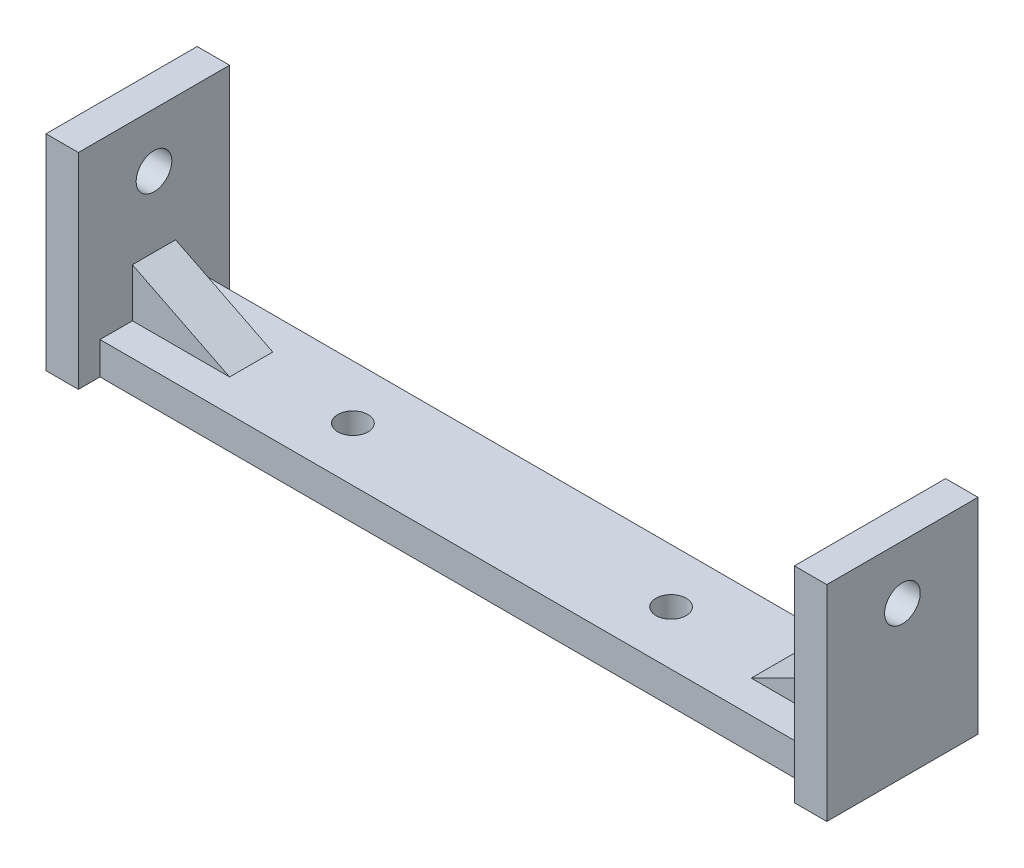
ISO-10303-21;
HEADER;
FILE_DESCRIPTION(('STEP AP214'),'2;1');
FILE_NAME('part.step','',(''),(''),'','','');
FILE_SCHEMA(('AUTOMOTIVE_DESIGN { 1 0 10303 214 1 1 1 1 }'));
ENDSEC;
DATA;
#1=APPLICATION_CONTEXT('core data for automotive mechanical design processes');
#2=APPLICATION_PROTOCOL_DEFINITION('international standard','automotive_design',2000,#1);
#3=PRODUCT_CONTEXT('',#1,'mechanical');
#4=PRODUCT('Part','Part','',(#3));
#5=PRODUCT_RELATED_PRODUCT_CATEGORY('part','',(#4));
#6=PRODUCT_DEFINITION_FORMATION('','',#4);
#7=PRODUCT_DEFINITION_CONTEXT('part definition',#1,'design');
#8=PRODUCT_DEFINITION('design','',#6,#7);
#9=PRODUCT_DEFINITION_SHAPE('','',#8);
#10=(LENGTH_UNIT() NAMED_UNIT(*) SI_UNIT(.MILLI.,.METRE.));
#11=(NAMED_UNIT(*) PLANE_ANGLE_UNIT() SI_UNIT($,.RADIAN.));
#12=(NAMED_UNIT(*) SI_UNIT($,.STERADIAN.) SOLID_ANGLE_UNIT());
#13=UNCERTAINTY_MEASURE_WITH_UNIT(LENGTH_MEASURE(1.E-05),#10,'distance_accuracy_value','');
#14=(GEOMETRIC_REPRESENTATION_CONTEXT(3) GLOBAL_UNCERTAINTY_ASSIGNED_CONTEXT((#13)) GLOBAL_UNIT_ASSIGNED_CONTEXT((#10,
#11,#12)) REPRESENTATION_CONTEXT('',''));
#15=CARTESIAN_POINT('',(0.,0.,0.));
#16=DIRECTION('',(0.,0.,1.));
#17=DIRECTION('',(1.,0.,0.));
#18=AXIS2_PLACEMENT_3D('',#15,#16,#17);
#19=CARTESIAN_POINT('',(0.,3.,0.));
#20=DIRECTION('',(0.,1.,0.));
#21=DIRECTION('',(0.,0.,1.));
#22=AXIS2_PLACEMENT_3D('',#19,#20,#21);
#23=PLANE('',#22);
#24=DIRECTION('',(1.,0.,0.));
#25=VECTOR('',#24,1.);
#26=CARTESIAN_POINT('',(24.15,3.,-2.));
#27=LINE('',#26,#25);
#28=CARTESIAN_POINT('',(24.15,3.,-2.));
#29=VERTEX_POINT('',#28);
#30=CARTESIAN_POINT('',(33.15,3.,-2.));
#31=VERTEX_POINT('',#30);
#32=EDGE_CURVE('E188',#29,#31,#27,.T.);
#33=ORIENTED_EDGE('',*,*,#32,.T.);
#34=DIRECTION('',(0.,0.,-1.));
#35=VECTOR('',#34,1.);
#36=CARTESIAN_POINT('',(33.15,3.,0.));
#37=LINE('',#36,#35);
#38=CARTESIAN_POINT('',(33.15,3.,-5.));
#39=VERTEX_POINT('',#38);
#40=EDGE_CURVE('E269',#31,#39,#37,.T.);
#41=ORIENTED_EDGE('',*,*,#40,.T.);
#42=DIRECTION('',(-1.,0.,0.));
#43=VECTOR('',#42,1.);
#44=CARTESIAN_POINT('',(36.15,3.,-5.));
#45=LINE('',#44,#43);
#46=CARTESIAN_POINT('',(-33.15,3.,-5.));
#47=VERTEX_POINT('',#46);
#48=EDGE_CURVE('E348',#39,#47,#45,.T.);
#49=ORIENTED_EDGE('',*,*,#48,.T.);
#50=DIRECTION('',(0.,0.,1.));
#51=VECTOR('',#50,1.);
#52=CARTESIAN_POINT('',(-33.15,3.,0.));
#53=LINE('',#52,#51);
#54=CARTESIAN_POINT('',(-33.15,3.,-2.));
#55=VERTEX_POINT('',#54);
#56=EDGE_CURVE('E319',#47,#55,#53,.T.);
#57=ORIENTED_EDGE('',*,*,#56,.T.);
#58=DIRECTION('',(1.,0.,0.));
#59=VECTOR('',#58,1.);
#60=CARTESIAN_POINT('',(-24.15,3.,-2.));
#61=LINE('',#60,#59);
#62=CARTESIAN_POINT('',(-24.15,3.,-2.));
#63=VERTEX_POINT('',#62);
#64=EDGE_CURVE('E199',#55,#63,#61,.T.);
#65=ORIENTED_EDGE('',*,*,#64,.T.);
#66=DIRECTION('',(0.,0.,1.));
#67=VECTOR('',#66,1.);
#68=CARTESIAN_POINT('',(-24.15,3.,-2.));
#69=LINE('',#68,#67);
#70=CARTESIAN_POINT('',(-24.15,3.,2.));
#71=VERTEX_POINT('',#70);
#72=EDGE_CURVE('E207',#63,#71,#69,.T.);
#73=ORIENTED_EDGE('',*,*,#72,.T.);
#74=DIRECTION('',(1.,0.,0.));
#75=VECTOR('',#74,1.);
#76=CARTESIAN_POINT('',(-24.15,3.,2.));
#77=LINE('',#76,#75);
#78=CARTESIAN_POINT('',(-33.15,3.,2.));
#79=VERTEX_POINT('',#78);
#80=EDGE_CURVE('E193',#79,#71,#77,.T.);
#81=ORIENTED_EDGE('',*,*,#80,.F.);
#82=CARTESIAN_POINT('',(-33.15,3.,5.));
#83=VERTEX_POINT('',#82);
#84=EDGE_CURVE('E318',#79,#83,#53,.T.);
#85=ORIENTED_EDGE('',*,*,#84,.T.);
#86=DIRECTION('',(1.,0.,0.));
#87=VECTOR('',#86,1.);
#88=CARTESIAN_POINT('',(36.15,3.,4.99999999999999));
#89=LINE('',#88,#87);
#90=CARTESIAN_POINT('',(33.15,3.,4.99999999999999));
#91=VERTEX_POINT('',#90);
#92=EDGE_CURVE('E344',#83,#91,#89,.T.);
#93=ORIENTED_EDGE('',*,*,#92,.T.);
#94=CARTESIAN_POINT('',(33.15,3.,2.));
#95=VERTEX_POINT('',#94);
#96=EDGE_CURVE('E270',#91,#95,#37,.T.);
#97=ORIENTED_EDGE('',*,*,#96,.T.);
#98=DIRECTION('',(1.,0.,0.));
#99=VECTOR('',#98,1.);
#100=CARTESIAN_POINT('',(24.15,3.,2.));
#101=LINE('',#100,#99);
#102=CARTESIAN_POINT('',(24.15,3.,2.));
#103=VERTEX_POINT('',#102);
#104=EDGE_CURVE('E60',#103,#95,#101,.T.);
#105=ORIENTED_EDGE('',*,*,#104,.F.);
#106=DIRECTION('',(0.,0.,1.));
#107=VECTOR('',#106,1.);
#108=CARTESIAN_POINT('',(24.15,3.,-2.));
#109=LINE('',#108,#107);
#110=EDGE_CURVE('E55',#29,#103,#109,.T.);
#111=ORIENTED_EDGE('',*,*,#110,.F.);
#112=EDGE_LOOP('',(#33,#41,#49,#57,#65,#73,#81,#85,#93,#97,#105,#111));
#113=FACE_BOUND('',#112,.T.);
#114=CARTESIAN_POINT('',(-14.73,3.,0.));
#115=DIRECTION('',(0.,1.,0.));
#116=DIRECTION('',(0.,0.,1.));
#117=AXIS2_PLACEMENT_3D('',#114,#115,#116);
#118=CIRCLE('',#117,1.4);
#119=CARTESIAN_POINT('',(-14.73,3.,1.4));
#120=VERTEX_POINT('',#119);
#121=EDGE_CURVE('E336',#120,#120,#118,.T.);
#122=ORIENTED_EDGE('',*,*,#121,.F.);
#123=EDGE_LOOP('',(#122));
#124=FACE_BOUND('',#123,.T.);
#125=CARTESIAN_POINT('',(14.73,3.,0.));
#126=DIRECTION('',(0.,1.,0.));
#127=DIRECTION('',(0.,0.,1.));
#128=AXIS2_PLACEMENT_3D('',#125,#126,#127);
#129=CIRCLE('',#128,1.4);
#130=CARTESIAN_POINT('',(14.73,3.,1.4));
#131=VERTEX_POINT('',#130);
#132=EDGE_CURVE('E328',#131,#131,#129,.T.);
#133=ORIENTED_EDGE('',*,*,#132,.F.);
#134=EDGE_LOOP('',(#133));
#135=FACE_BOUND('',#134,.T.);
#136=ADVANCED_FACE('F39',(#113,#124,#135),#23,.T.);
#137=CARTESIAN_POINT('',(-33.15,19.,7.));
#138=DIRECTION('',(-1.,0.,0.));
#139=DIRECTION('',(0.,0.,1.));
#140=AXIS2_PLACEMENT_3D('',#137,#138,#139);
#141=PLANE('',#140);
#142=CARTESIAN_POINT('',(-33.15,14.,0.));
#143=DIRECTION('',(-1.,0.,0.));
#144=DIRECTION('',(0.,0.,1.));
#145=AXIS2_PLACEMENT_3D('',#142,#143,#144);
#146=CIRCLE('',#145,1.65);
#147=CARTESIAN_POINT('',(-33.15,14.,1.65));
#148=VERTEX_POINT('',#147);
#149=EDGE_CURVE('E220',#148,#148,#146,.T.);
#150=ORIENTED_EDGE('',*,*,#149,.T.);
#151=EDGE_LOOP('',(#150));
#152=FACE_BOUND('',#151,.T.);
#153=DIRECTION('',(0.,1.,0.));
#154=VECTOR('',#153,1.);
#155=CARTESIAN_POINT('',(-33.15,19.,-2.));
#156=LINE('',#155,#154);
#157=CARTESIAN_POINT('',(-33.15,7.5,-2.));
#158=VERTEX_POINT('',#157);
#159=EDGE_CURVE('E177',#55,#158,#156,.T.);
#160=ORIENTED_EDGE('',*,*,#159,.F.);
#161=ORIENTED_EDGE('',*,*,#56,.F.);
#162=DIRECTION('',(0.,-1.,0.));
#163=VECTOR('',#162,1.);
#164=CARTESIAN_POINT('',(-33.15,3.,-5.));
#165=LINE('',#164,#163);
#166=CARTESIAN_POINT('',(-33.15,0.,-5.));
#167=VERTEX_POINT('',#166);
#168=EDGE_CURVE('E352',#47,#167,#165,.T.);
#169=ORIENTED_EDGE('',*,*,#168,.T.);
#170=DIRECTION('',(0.,0.,-1.));
#171=VECTOR('',#170,1.);
#172=CARTESIAN_POINT('',(-33.15,0.,7.));
#173=LINE('',#172,#171);
#174=CARTESIAN_POINT('',(-33.15,0.,-7.00000000000001));
#175=VERTEX_POINT('',#174);
#176=EDGE_CURVE('E295',#167,#175,#173,.T.);
#177=ORIENTED_EDGE('',*,*,#176,.T.);
#178=DIRECTION('',(0.,-1.,0.));
#179=VECTOR('',#178,1.);
#180=CARTESIAN_POINT('',(-33.15,19.,-7.00000000000001));
#181=LINE('',#180,#179);
#182=CARTESIAN_POINT('',(-33.15,19.,-7.00000000000001));
#183=VERTEX_POINT('',#182);
#184=EDGE_CURVE('E306',#183,#175,#181,.T.);
#185=ORIENTED_EDGE('',*,*,#184,.F.);
#186=DIRECTION('',(0.,0.,-1.));
#187=VECTOR('',#186,1.);
#188=CARTESIAN_POINT('',(-33.15,19.,7.));
#189=LINE('',#188,#187);
#190=CARTESIAN_POINT('',(-33.15,19.,7.));
#191=VERTEX_POINT('',#190);
#192=EDGE_CURVE('E286',#191,#183,#189,.T.);
#193=ORIENTED_EDGE('',*,*,#192,.F.);
#194=DIRECTION('',(0.,-1.,0.));
#195=VECTOR('',#194,1.);
#196=CARTESIAN_POINT('',(-33.15,19.,7.));
#197=LINE('',#196,#195);
#198=CARTESIAN_POINT('',(-33.15,0.,7.));
#199=VERTEX_POINT('',#198);
#200=EDGE_CURVE('E310',#191,#199,#197,.T.);
#201=ORIENTED_EDGE('',*,*,#200,.T.);
#202=CARTESIAN_POINT('',(-33.15,0.,5.));
#203=VERTEX_POINT('',#202);
#204=EDGE_CURVE('E296',#199,#203,#173,.T.);
#205=ORIENTED_EDGE('',*,*,#204,.T.);
#206=DIRECTION('',(0.,1.,0.));
#207=VECTOR('',#206,1.);
#208=CARTESIAN_POINT('',(-33.15,3.,5.));
#209=LINE('',#208,#207);
#210=EDGE_CURVE('E323',#203,#83,#209,.T.);
#211=ORIENTED_EDGE('',*,*,#210,.T.);
#212=ORIENTED_EDGE('',*,*,#84,.F.);
#213=DIRECTION('',(0.,1.,0.));
#214=VECTOR('',#213,1.);
#215=CARTESIAN_POINT('',(-33.15,19.,2.));
#216=LINE('',#215,#214);
#217=CARTESIAN_POINT('',(-33.15,7.5,2.));
#218=VERTEX_POINT('',#217);
#219=EDGE_CURVE('E366',#79,#218,#216,.T.);
#220=ORIENTED_EDGE('',*,*,#219,.T.);
#221=DIRECTION('',(0.,0.,-1.));
#222=VECTOR('',#221,1.);
#223=CARTESIAN_POINT('',(-33.15,7.5,7.));
#224=LINE('',#223,#222);
#225=EDGE_CURVE('E373',#218,#158,#224,.T.);
#226=ORIENTED_EDGE('',*,*,#225,.T.);
#227=EDGE_LOOP('',(#160,#161,#169,#177,#185,#193,#201,#205,#211,#212,#220,#226));
#228=FACE_BOUND('',#227,.T.);
#229=ADVANCED_FACE('F388',(#152,#228),#141,.F.);
#230=CARTESIAN_POINT('',(36.15,3.,4.99999999999999));
#231=DIRECTION('',(0.,0.,-1.));
#232=DIRECTION('',(-1.,0.,0.));
#233=AXIS2_PLACEMENT_3D('',#230,#231,#232);
#234=PLANE('',#233);
#235=DIRECTION('',(0.,-1.,0.));
#236=VECTOR('',#235,1.);
#237=CARTESIAN_POINT('',(33.15,3.,4.99999999999999));
#238=LINE('',#237,#236);
#239=CARTESIAN_POINT('',(33.15,0.,4.99999999999999));
#240=VERTEX_POINT('',#239);
#241=EDGE_CURVE('E273',#91,#240,#238,.T.);
#242=ORIENTED_EDGE('',*,*,#241,.F.);
#243=ORIENTED_EDGE('',*,*,#92,.F.);
#244=ORIENTED_EDGE('',*,*,#210,.F.);
#245=DIRECTION('',(1.,0.,0.));
#246=VECTOR('',#245,1.);
#247=CARTESIAN_POINT('',(36.15,0.,4.99999999999999));
#248=LINE('',#247,#246);
#249=EDGE_CURVE('E355',#203,#240,#248,.T.);
#250=ORIENTED_EDGE('',*,*,#249,.T.);
#251=EDGE_LOOP('',(#242,#243,#244,#250));
#252=FACE_BOUND('',#251,.T.);
#253=ADVANCED_FACE('F444',(#252),#234,.F.);
#254=CARTESIAN_POINT('',(36.15,3.,-5.));
#255=DIRECTION('',(0.,0.,1.));
#256=DIRECTION('',(1.,0.,0.));
#257=AXIS2_PLACEMENT_3D('',#254,#255,#256);
#258=PLANE('',#257);
#259=DIRECTION('',(0.,1.,0.));
#260=VECTOR('',#259,1.);
#261=CARTESIAN_POINT('',(33.15,3.,-5.));
#262=LINE('',#261,#260);
#263=CARTESIAN_POINT('',(33.15,0.,-5.));
#264=VERTEX_POINT('',#263);
#265=EDGE_CURVE('E265',#264,#39,#262,.T.);
#266=ORIENTED_EDGE('',*,*,#265,.F.);
#267=DIRECTION('',(-1.,0.,0.));
#268=VECTOR('',#267,1.);
#269=CARTESIAN_POINT('',(36.15,0.,-5.));
#270=LINE('',#269,#268);
#271=EDGE_CURVE('E349',#264,#167,#270,.T.);
#272=ORIENTED_EDGE('',*,*,#271,.T.);
#273=ORIENTED_EDGE('',*,*,#168,.F.);
#274=ORIENTED_EDGE('',*,*,#48,.F.);
#275=EDGE_LOOP('',(#266,#272,#273,#274));
#276=FACE_BOUND('',#275,.T.);
#277=ADVANCED_FACE('F453',(#276),#258,.F.);
#278=CARTESIAN_POINT('',(0.,0.,0.));
#279=DIRECTION('',(0.,1.,0.));
#280=DIRECTION('',(0.,0.,1.));
#281=AXIS2_PLACEMENT_3D('',#278,#279,#280);
#282=PLANE('',#281);
#283=DIRECTION('',(0.,0.,-1.));
#284=VECTOR('',#283,1.);
#285=CARTESIAN_POINT('',(36.15,0.,4.99999999999999));
#286=LINE('',#285,#284);
#287=CARTESIAN_POINT('',(36.15,0.,7.));
#288=VERTEX_POINT('',#287);
#289=CARTESIAN_POINT('',(36.15,0.,-7.));
#290=VERTEX_POINT('',#289);
#291=EDGE_CURVE('E358',#288,#290,#286,.T.);
#292=ORIENTED_EDGE('',*,*,#291,.F.);
#293=DIRECTION('',(1.,0.,0.));
#294=VECTOR('',#293,1.);
#295=CARTESIAN_POINT('',(36.15,0.,7.));
#296=LINE('',#295,#294);
#297=CARTESIAN_POINT('',(33.15,0.,7.));
#298=VERTEX_POINT('',#297);
#299=EDGE_CURVE('E230',#298,#288,#296,.T.);
#300=ORIENTED_EDGE('',*,*,#299,.F.);
#301=DIRECTION('',(0.,0.,1.));
#302=VECTOR('',#301,1.);
#303=CARTESIAN_POINT('',(33.15,0.,7.));
#304=LINE('',#303,#302);
#305=EDGE_CURVE('E242',#240,#298,#304,.T.);
#306=ORIENTED_EDGE('',*,*,#305,.F.);
#307=ORIENTED_EDGE('',*,*,#249,.F.);
#308=ORIENTED_EDGE('',*,*,#204,.F.);
#309=DIRECTION('',(1.,0.,0.));
#310=VECTOR('',#309,1.);
#311=CARTESIAN_POINT('',(-36.15,0.,7.));
#312=LINE('',#311,#310);
#313=CARTESIAN_POINT('',(-36.15,0.,7.));
#314=VERTEX_POINT('',#313);
#315=EDGE_CURVE('E277',#314,#199,#312,.T.);
#316=ORIENTED_EDGE('',*,*,#315,.F.);
#317=DIRECTION('',(0.,0.,1.));
#318=VECTOR('',#317,1.);
#319=CARTESIAN_POINT('',(-36.15,0.,5.));
#320=LINE('',#319,#318);
#321=CARTESIAN_POINT('',(-36.15,0.,-7.));
#322=VERTEX_POINT('',#321);
#323=EDGE_CURVE('E340',#322,#314,#320,.T.);
#324=ORIENTED_EDGE('',*,*,#323,.F.);
#325=DIRECTION('',(-1.,0.,0.));
#326=VECTOR('',#325,1.);
#327=CARTESIAN_POINT('',(-36.15,0.,-7.));
#328=LINE('',#327,#326);
#329=EDGE_CURVE('E283',#175,#322,#328,.T.);
#330=ORIENTED_EDGE('',*,*,#329,.F.);
#331=ORIENTED_EDGE('',*,*,#176,.F.);
#332=ORIENTED_EDGE('',*,*,#271,.F.);
#333=CARTESIAN_POINT('',(33.15,0.,-7.00000000000001));
#334=VERTEX_POINT('',#333);
#335=EDGE_CURVE('E243',#334,#264,#304,.T.);
#336=ORIENTED_EDGE('',*,*,#335,.F.);
#337=DIRECTION('',(-1.,0.,0.));
#338=VECTOR('',#337,1.);
#339=CARTESIAN_POINT('',(36.15,0.,-7.));
#340=LINE('',#339,#338);
#341=EDGE_CURVE('E224',#290,#334,#340,.T.);
#342=ORIENTED_EDGE('',*,*,#341,.F.);
#343=EDGE_LOOP('',(#292,#300,#306,#307,#308,#316,#324,#330,#331,#332,#336,#342));
#344=FACE_BOUND('',#343,.T.);
#345=CARTESIAN_POINT('',(-14.73,0.,0.));
#346=DIRECTION('',(0.,1.,0.));
#347=DIRECTION('',(0.,0.,1.));
#348=AXIS2_PLACEMENT_3D('',#345,#346,#347);
#349=CIRCLE('',#348,1.4);
#350=CARTESIAN_POINT('',(-14.73,0.,1.4));
#351=VERTEX_POINT('',#350);
#352=EDGE_CURVE('E332',#351,#351,#349,.T.);
#353=ORIENTED_EDGE('',*,*,#352,.T.);
#354=EDGE_LOOP('',(#353));
#355=FACE_BOUND('',#354,.T.);
#356=CARTESIAN_POINT('',(14.73,0.,0.));
#357=DIRECTION('',(0.,1.,0.));
#358=DIRECTION('',(0.,0.,1.));
#359=AXIS2_PLACEMENT_3D('',#356,#357,#358);
#360=CIRCLE('',#359,1.4);
#361=CARTESIAN_POINT('',(14.73,0.,1.4));
#362=VERTEX_POINT('',#361);
#363=EDGE_CURVE('E327',#362,#362,#360,.T.);
#364=ORIENTED_EDGE('',*,*,#363,.T.);
#365=EDGE_LOOP('',(#364));
#366=FACE_BOUND('',#365,.T.);
#367=ADVANCED_FACE('F402',(#344,#355,#366),#282,.F.);
#368=CARTESIAN_POINT('',(-36.15,3.,5.));
#369=DIRECTION('',(1.,0.,0.));
#370=DIRECTION('',(0.,0.,-1.));
#371=AXIS2_PLACEMENT_3D('',#368,#369,#370);
#372=PLANE('',#371);
#373=ORIENTED_EDGE('',*,*,#323,.T.);
#374=DIRECTION('',(0.,-1.,0.));
#375=VECTOR('',#374,1.);
#376=CARTESIAN_POINT('',(-36.15,19.,7.));
#377=LINE('',#376,#375);
#378=CARTESIAN_POINT('',(-36.15,19.,7.));
#379=VERTEX_POINT('',#378);
#380=EDGE_CURVE('E314',#379,#314,#377,.T.);
#381=ORIENTED_EDGE('',*,*,#380,.F.);
#382=DIRECTION('',(0.,0.,1.));
#383=VECTOR('',#382,1.);
#384=CARTESIAN_POINT('',(-36.15,19.,7.));
#385=LINE('',#384,#383);
#386=CARTESIAN_POINT('',(-36.15,19.,-7.));
#387=VERTEX_POINT('',#386);
#388=EDGE_CURVE('E278',#387,#379,#385,.T.);
#389=ORIENTED_EDGE('',*,*,#388,.F.);
#390=DIRECTION('',(0.,-1.,0.));
#391=VECTOR('',#390,1.);
#392=CARTESIAN_POINT('',(-36.15,19.,-7.));
#393=LINE('',#392,#391);
#394=EDGE_CURVE('E292',#387,#322,#393,.T.);
#395=ORIENTED_EDGE('',*,*,#394,.T.);
#396=EDGE_LOOP('',(#373,#381,#389,#395));
#397=FACE_BOUND('',#396,.T.);
#398=CARTESIAN_POINT('',(-36.15,14.,0.));
#399=DIRECTION('',(-1.,0.,0.));
#400=DIRECTION('',(0.,0.,1.));
#401=AXIS2_PLACEMENT_3D('',#398,#399,#400);
#402=CIRCLE('',#401,1.65);
#403=CARTESIAN_POINT('',(-36.15,14.,1.65));
#404=VERTEX_POINT('',#403);
#405=EDGE_CURVE('E211',#404,#404,#402,.T.);
#406=ORIENTED_EDGE('',*,*,#405,.F.);
#407=EDGE_LOOP('',(#406));
#408=FACE_BOUND('',#407,.T.);
#409=ADVANCED_FACE('F41',(#397,#408),#372,.F.);
#410=CARTESIAN_POINT('',(36.15,3.,4.99999999999999));
#411=DIRECTION('',(-1.,0.,0.));
#412=DIRECTION('',(0.,0.,1.));
#413=AXIS2_PLACEMENT_3D('',#410,#411,#412);
#414=PLANE('',#413);
#415=CARTESIAN_POINT('',(36.15,14.,0.));
#416=DIRECTION('',(-1.,0.,0.));
#417=DIRECTION('',(0.,0.,1.));
#418=AXIS2_PLACEMENT_3D('',#415,#416,#417);
#419=CIRCLE('',#418,1.65);
#420=CARTESIAN_POINT('',(36.15,14.,1.65));
#421=VERTEX_POINT('',#420);
#422=EDGE_CURVE('E215',#421,#421,#419,.F.);
#423=ORIENTED_EDGE('',*,*,#422,.F.);
#424=EDGE_LOOP('',(#423));
#425=FACE_BOUND('',#424,.T.);
#426=DIRECTION('',(0.,-1.,0.));
#427=VECTOR('',#426,1.);
#428=CARTESIAN_POINT('',(36.15,19.,7.));
#429=LINE('',#428,#427);
#430=CARTESIAN_POINT('',(36.15,19.,7.));
#431=VERTEX_POINT('',#430);
#432=EDGE_CURVE('E239',#431,#288,#429,.T.);
#433=ORIENTED_EDGE('',*,*,#432,.T.);
#434=ORIENTED_EDGE('',*,*,#291,.T.);
#435=DIRECTION('',(0.,-1.,0.));
#436=VECTOR('',#435,1.);
#437=CARTESIAN_POINT('',(36.15,19.,-7.));
#438=LINE('',#437,#436);
#439=CARTESIAN_POINT('',(36.15,19.,-7.));
#440=VERTEX_POINT('',#439);
#441=EDGE_CURVE('E261',#440,#290,#438,.T.);
#442=ORIENTED_EDGE('',*,*,#441,.F.);
#443=DIRECTION('',(0.,0.,-1.));
#444=VECTOR('',#443,1.);
#445=CARTESIAN_POINT('',(36.15,19.,7.));
#446=LINE('',#445,#444);
#447=EDGE_CURVE('E225',#431,#440,#446,.T.);
#448=ORIENTED_EDGE('',*,*,#447,.F.);
#449=EDGE_LOOP('',(#433,#434,#442,#448));
#450=FACE_BOUND('',#449,.T.);
#451=ADVANCED_FACE('F421',(#425,#450),#414,.F.);
#452=CARTESIAN_POINT('',(-14.73,3.,0.));
#453=DIRECTION('',(0.,-1.,0.));
#454=DIRECTION('',(0.,0.,-1.));
#455=AXIS2_PLACEMENT_3D('',#452,#453,#454);
#456=CYLINDRICAL_SURFACE('',#455,1.4);
#457=ORIENTED_EDGE('',*,*,#121,.T.);
#458=EDGE_LOOP('',(#457));
#459=FACE_BOUND('',#458,.T.);
#460=ORIENTED_EDGE('',*,*,#352,.F.);
#461=EDGE_LOOP('',(#460));
#462=FACE_BOUND('',#461,.T.);
#463=ADVANCED_FACE('F449',(#459,#462),#456,.F.);
#464=CARTESIAN_POINT('',(14.73,3.,0.));
#465=DIRECTION('',(0.,-1.,0.));
#466=DIRECTION('',(0.,0.,-1.));
#467=AXIS2_PLACEMENT_3D('',#464,#465,#466);
#468=CYLINDRICAL_SURFACE('',#467,1.4);
#469=ORIENTED_EDGE('',*,*,#132,.T.);
#470=EDGE_LOOP('',(#469));
#471=FACE_BOUND('',#470,.T.);
#472=ORIENTED_EDGE('',*,*,#363,.F.);
#473=EDGE_LOOP('',(#472));
#474=FACE_BOUND('',#473,.T.);
#475=ADVANCED_FACE('F484',(#471,#474),#468,.F.);
#476=CARTESIAN_POINT('',(-36.15,19.,7.));
#477=DIRECTION('',(0.,0.,-1.));
#478=DIRECTION('',(-1.,0.,0.));
#479=AXIS2_PLACEMENT_3D('',#476,#477,#478);
#480=PLANE('',#479);
#481=ORIENTED_EDGE('',*,*,#315,.T.);
#482=ORIENTED_EDGE('',*,*,#200,.F.);
#483=DIRECTION('',(1.,0.,0.));
#484=VECTOR('',#483,1.);
#485=CARTESIAN_POINT('',(-36.15,19.,7.));
#486=LINE('',#485,#484);
#487=EDGE_CURVE('E282',#379,#191,#486,.T.);
#488=ORIENTED_EDGE('',*,*,#487,.F.);
#489=ORIENTED_EDGE('',*,*,#380,.T.);
#490=EDGE_LOOP('',(#481,#482,#488,#489));
#491=FACE_BOUND('',#490,.T.);
#492=ADVANCED_FACE('F467',(#491),#480,.F.);
#493=CARTESIAN_POINT('',(-36.15,19.,-7.));
#494=DIRECTION('',(0.,0.,1.));
#495=DIRECTION('',(1.,0.,0.));
#496=AXIS2_PLACEMENT_3D('',#493,#494,#495);
#497=PLANE('',#496);
#498=ORIENTED_EDGE('',*,*,#329,.T.);
#499=ORIENTED_EDGE('',*,*,#394,.F.);
#500=DIRECTION('',(-1.,0.,0.));
#501=VECTOR('',#500,1.);
#502=CARTESIAN_POINT('',(-36.15,19.,-7.));
#503=LINE('',#502,#501);
#504=EDGE_CURVE('E289',#183,#387,#503,.T.);
#505=ORIENTED_EDGE('',*,*,#504,.F.);
#506=ORIENTED_EDGE('',*,*,#184,.T.);
#507=EDGE_LOOP('',(#498,#499,#505,#506));
#508=FACE_BOUND('',#507,.T.);
#509=ADVANCED_FACE('F472',(#508),#497,.F.);
#510=CARTESIAN_POINT('',(0.,19.,0.));
#511=DIRECTION('',(0.,-1.,0.));
#512=DIRECTION('',(0.,0.,-1.));
#513=AXIS2_PLACEMENT_3D('',#510,#511,#512);
#514=PLANE('',#513);
#515=ORIENTED_EDGE('',*,*,#388,.T.);
#516=ORIENTED_EDGE('',*,*,#487,.T.);
#517=ORIENTED_EDGE('',*,*,#192,.T.);
#518=ORIENTED_EDGE('',*,*,#504,.T.);
#519=EDGE_LOOP('',(#515,#516,#517,#518));
#520=FACE_BOUND('',#519,.T.);
#521=ADVANCED_FACE('F435',(#520),#514,.F.);
#522=CARTESIAN_POINT('',(33.15,19.,7.));
#523=DIRECTION('',(1.,0.,0.));
#524=DIRECTION('',(0.,0.,-1.));
#525=AXIS2_PLACEMENT_3D('',#522,#523,#524);
#526=PLANE('',#525);
#527=CARTESIAN_POINT('',(33.15,14.,0.));
#528=DIRECTION('',(1.,0.,0.));
#529=DIRECTION('',(0.,0.,-1.));
#530=AXIS2_PLACEMENT_3D('',#527,#528,#529);
#531=CIRCLE('',#530,1.65);
#532=CARTESIAN_POINT('',(33.15,14.,1.65));
#533=VERTEX_POINT('',#532);
#534=EDGE_CURVE('E219',#533,#533,#531,.T.);
#535=ORIENTED_EDGE('',*,*,#534,.T.);
#536=EDGE_LOOP('',(#535));
#537=FACE_BOUND('',#536,.T.);
#538=ORIENTED_EDGE('',*,*,#40,.F.);
#539=DIRECTION('',(0.,1.,0.));
#540=VECTOR('',#539,1.);
#541=CARTESIAN_POINT('',(33.15,19.,-2.));
#542=LINE('',#541,#540);
#543=CARTESIAN_POINT('',(33.15,7.5,-2.));
#544=VERTEX_POINT('',#543);
#545=EDGE_CURVE('E11',#31,#544,#542,.T.);
#546=ORIENTED_EDGE('',*,*,#545,.T.);
#547=DIRECTION('',(0.,0.,1.));
#548=VECTOR('',#547,1.);
#549=CARTESIAN_POINT('',(33.15,7.5,7.));
#550=LINE('',#549,#548);
#551=CARTESIAN_POINT('',(33.15,7.5,2.));
#552=VERTEX_POINT('',#551);
#553=EDGE_CURVE('E48',#544,#552,#550,.T.);
#554=ORIENTED_EDGE('',*,*,#553,.T.);
#555=DIRECTION('',(0.,1.,0.));
#556=VECTOR('',#555,1.);
#557=CARTESIAN_POINT('',(33.15,19.,2.));
#558=LINE('',#557,#556);
#559=EDGE_CURVE('E167',#95,#552,#558,.T.);
#560=ORIENTED_EDGE('',*,*,#559,.F.);
#561=ORIENTED_EDGE('',*,*,#96,.F.);
#562=ORIENTED_EDGE('',*,*,#241,.T.);
#563=ORIENTED_EDGE('',*,*,#305,.T.);
#564=DIRECTION('',(0.,-1.,0.));
#565=VECTOR('',#564,1.);
#566=CARTESIAN_POINT('',(33.15,19.,7.));
#567=LINE('',#566,#565);
#568=CARTESIAN_POINT('',(33.15,19.,7.));
#569=VERTEX_POINT('',#568);
#570=EDGE_CURVE('E253',#569,#298,#567,.T.);
#571=ORIENTED_EDGE('',*,*,#570,.F.);
#572=DIRECTION('',(0.,0.,1.));
#573=VECTOR('',#572,1.);
#574=CARTESIAN_POINT('',(33.15,19.,7.));
#575=LINE('',#574,#573);
#576=CARTESIAN_POINT('',(33.15,19.,-7.00000000000001));
#577=VERTEX_POINT('',#576);
#578=EDGE_CURVE('E233',#577,#569,#575,.T.);
#579=ORIENTED_EDGE('',*,*,#578,.F.);
#580=DIRECTION('',(0.,-1.,0.));
#581=VECTOR('',#580,1.);
#582=CARTESIAN_POINT('',(33.15,19.,-7.00000000000001));
#583=LINE('',#582,#581);
#584=EDGE_CURVE('E257',#577,#334,#583,.T.);
#585=ORIENTED_EDGE('',*,*,#584,.T.);
#586=ORIENTED_EDGE('',*,*,#335,.T.);
#587=ORIENTED_EDGE('',*,*,#265,.T.);
#588=EDGE_LOOP('',(#538,#546,#554,#560,#561,#562,#563,#571,#579,#585,#586,#587));
#589=FACE_BOUND('',#588,.T.);
#590=ADVANCED_FACE('F165',(#537,#589),#526,.F.);
#591=CARTESIAN_POINT('',(36.15,19.,-7.));
#592=DIRECTION('',(0.,0.,1.));
#593=DIRECTION('',(1.,0.,0.));
#594=AXIS2_PLACEMENT_3D('',#591,#592,#593);
#595=PLANE('',#594);
#596=ORIENTED_EDGE('',*,*,#341,.T.);
#597=ORIENTED_EDGE('',*,*,#584,.F.);
#598=DIRECTION('',(-1.,0.,0.));
#599=VECTOR('',#598,1.);
#600=CARTESIAN_POINT('',(36.15,19.,-7.));
#601=LINE('',#600,#599);
#602=EDGE_CURVE('E229',#440,#577,#601,.T.);
#603=ORIENTED_EDGE('',*,*,#602,.F.);
#604=ORIENTED_EDGE('',*,*,#441,.T.);
#605=EDGE_LOOP('',(#596,#597,#603,#604));
#606=FACE_BOUND('',#605,.T.);
#607=ADVANCED_FACE('F427',(#606),#595,.F.);
#608=CARTESIAN_POINT('',(36.15,19.,7.));
#609=DIRECTION('',(0.,0.,-1.));
#610=DIRECTION('',(-1.,0.,0.));
#611=AXIS2_PLACEMENT_3D('',#608,#609,#610);
#612=PLANE('',#611);
#613=ORIENTED_EDGE('',*,*,#299,.T.);
#614=ORIENTED_EDGE('',*,*,#432,.F.);
#615=DIRECTION('',(1.,0.,0.));
#616=VECTOR('',#615,1.);
#617=CARTESIAN_POINT('',(36.15,19.,7.));
#618=LINE('',#617,#616);
#619=EDGE_CURVE('E236',#569,#431,#618,.T.);
#620=ORIENTED_EDGE('',*,*,#619,.F.);
#621=ORIENTED_EDGE('',*,*,#570,.T.);
#622=EDGE_LOOP('',(#613,#614,#620,#621));
#623=FACE_BOUND('',#622,.T.);
#624=ADVANCED_FACE('F416',(#623),#612,.F.);
#625=CARTESIAN_POINT('',(0.,19.,0.));
#626=DIRECTION('',(0.,1.,0.));
#627=DIRECTION('',(0.,0.,1.));
#628=AXIS2_PLACEMENT_3D('',#625,#626,#627);
#629=PLANE('',#628);
#630=ORIENTED_EDGE('',*,*,#447,.T.);
#631=ORIENTED_EDGE('',*,*,#602,.T.);
#632=ORIENTED_EDGE('',*,*,#578,.T.);
#633=ORIENTED_EDGE('',*,*,#619,.T.);
#634=EDGE_LOOP('',(#630,#631,#632,#633));
#635=FACE_BOUND('',#634,.T.);
#636=ADVANCED_FACE('F424',(#635),#629,.T.);
#637=CARTESIAN_POINT('',(40.8169047558312,14.,0.));
#638=DIRECTION('',(-1.,0.,0.));
#639=DIRECTION('',(0.,0.,1.));
#640=AXIS2_PLACEMENT_3D('',#637,#638,#639);
#641=CYLINDRICAL_SURFACE('',#640,1.65);
#642=CARTESIAN_POINT('',(36.15,14.,1.65));
#643=CARTESIAN_POINT('',(36.11875,14.,1.65));
#644=CARTESIAN_POINT('',(36.0875,14.,1.65));
#645=CARTESIAN_POINT('',(36.025,14.,1.65));
#646=CARTESIAN_POINT('',(35.99375,14.,1.65));
#647=CARTESIAN_POINT('',(35.93125,14.,1.65));
#648=CARTESIAN_POINT('',(35.9,14.,1.65));
#649=CARTESIAN_POINT('',(35.8375,14.,1.65));
#650=CARTESIAN_POINT('',(35.80625,14.,1.65));
#651=CARTESIAN_POINT('',(35.74375,14.,1.65));
#652=CARTESIAN_POINT('',(35.7125,14.,1.65));
#653=CARTESIAN_POINT('',(35.65,14.,1.65));
#654=CARTESIAN_POINT('',(35.61875,14.,1.65));
#655=CARTESIAN_POINT('',(35.55625,14.,1.65));
#656=CARTESIAN_POINT('',(35.525,14.,1.65));
#657=CARTESIAN_POINT('',(35.4625,14.,1.65));
#658=CARTESIAN_POINT('',(35.43125,14.,1.65));
#659=CARTESIAN_POINT('',(35.36875,14.,1.65));
#660=CARTESIAN_POINT('',(35.3375,14.,1.65));
#661=CARTESIAN_POINT('',(35.275,14.,1.65));
#662=CARTESIAN_POINT('',(35.24375,14.,1.65));
#663=CARTESIAN_POINT('',(35.18125,14.,1.65));
#664=CARTESIAN_POINT('',(35.15,14.,1.65));
#665=CARTESIAN_POINT('',(35.0875,14.,1.65));
#666=CARTESIAN_POINT('',(35.05625,14.,1.65));
#667=CARTESIAN_POINT('',(34.99375,14.,1.65));
#668=CARTESIAN_POINT('',(34.9625,14.,1.65));
#669=CARTESIAN_POINT('',(34.9,14.,1.65));
#670=CARTESIAN_POINT('',(34.86875,14.,1.65));
#671=CARTESIAN_POINT('',(34.80625,14.,1.65));
#672=CARTESIAN_POINT('',(34.775,14.,1.65));
#673=CARTESIAN_POINT('',(34.7125,14.,1.65));
#674=CARTESIAN_POINT('',(34.68125,14.,1.65));
#675=CARTESIAN_POINT('',(34.61875,14.,1.65));
#676=CARTESIAN_POINT('',(34.5875,14.,1.65));
#677=CARTESIAN_POINT('',(34.525,14.,1.65));
#678=CARTESIAN_POINT('',(34.49375,14.,1.65));
#679=CARTESIAN_POINT('',(34.43125,14.,1.65));
#680=CARTESIAN_POINT('',(34.4,14.,1.65));
#681=CARTESIAN_POINT('',(34.3375,14.,1.65));
#682=CARTESIAN_POINT('',(34.30625,14.,1.65));
#683=CARTESIAN_POINT('',(34.24375,14.,1.65));
#684=CARTESIAN_POINT('',(34.2125,14.,1.65));
#685=CARTESIAN_POINT('',(34.15,14.,1.65));
#686=CARTESIAN_POINT('',(34.11875,14.,1.65));
#687=CARTESIAN_POINT('',(34.05625,14.,1.65));
#688=CARTESIAN_POINT('',(34.025,14.,1.65));
#689=CARTESIAN_POINT('',(33.9625,14.,1.65));
#690=CARTESIAN_POINT('',(33.93125,14.,1.65));
#691=CARTESIAN_POINT('',(33.86875,14.,1.65));
#692=CARTESIAN_POINT('',(33.8375,14.,1.65));
#693=CARTESIAN_POINT('',(33.775,14.,1.65));
#694=CARTESIAN_POINT('',(33.74375,14.,1.65));
#695=CARTESIAN_POINT('',(33.68125,14.,1.65));
#696=CARTESIAN_POINT('',(33.65,14.,1.65));
#697=CARTESIAN_POINT('',(33.5875,14.,1.65));
#698=CARTESIAN_POINT('',(33.55625,14.,1.65));
#699=CARTESIAN_POINT('',(33.49375,14.,1.65));
#700=CARTESIAN_POINT('',(33.4625,14.,1.65));
#701=CARTESIAN_POINT('',(33.4,14.,1.65));
#702=CARTESIAN_POINT('',(33.36875,14.,1.65));
#703=CARTESIAN_POINT('',(33.30625,14.,1.65));
#704=CARTESIAN_POINT('',(33.275,14.,1.65));
#705=CARTESIAN_POINT('',(33.2125,14.,1.65));
#706=CARTESIAN_POINT('',(33.18125,14.,1.65));
#707=CARTESIAN_POINT('',(33.15,14.,1.65));
#708=B_SPLINE_CURVE_WITH_KNOTS('',3,(#642,#643,#644,#645,#646,#647,#648,#649,#650,#651,#652,
#653,#654,#655,#656,#657,#658,#659,#660,#661,#662,#663,#664,#665,#666,#667,#668,#669,#670,#671,
#672,#673,#674,#675,#676,#677,#678,#679,#680,#681,#682,#683,#684,#685,#686,#687,#688,#689,#690,
#691,#692,#693,#694,#695,#696,#697,#698,#699,#700,#701,#702,#703,#704,#705,#706,#707),
.UNSPECIFIED.,.F.,.F.,(4,2,2,2,2,2,2,2,2,2,2,2,2,2,2,2,2,2,2,2,2,2,2,2,2,2,2,2,2,2,2,2,4),(0.,
0.0937499999999966,0.1875,0.281249999999997,0.374999999999993,0.468749999999997,
0.562499999999994,0.656249999999997,0.749999999999994,0.843749999999997,0.937499999999994,
1.03125,1.12499999999999,1.21875,1.31249999999999,1.40624999999999,1.49999999999999,1.59375,
1.68749999999999,1.78124999999999,1.87499999999999,1.96874999999999,2.06249999999999,
2.15624999999999,2.25,2.34374999999999,2.4375,2.53124999999999,2.625,2.71874999999999,
2.81249999999999,2.90624999999999,2.99999999999999),.UNSPECIFIED.);
#709=EDGE_CURVE('BSEAM586',#421,#533,#708,.T.);
#710=ORIENTED_EDGE('',*,*,#422,.T.);
#711=ORIENTED_EDGE('',*,*,#534,.F.);
#712=ORIENTED_EDGE('',*,*,#709,.T.);
#713=ORIENTED_EDGE('',*,*,#709,.F.);
#714=EDGE_LOOP('',(#710,#712,#711,#713));
#715=FACE_BOUND('',#714,.T.);
#716=ADVANCED_FACE('F586',(#715),#641,.F.);
#717=CARTESIAN_POINT('',(-36.15,14.,1.65));
#718=CARTESIAN_POINT('',(-36.11875,14.,1.65));
#719=CARTESIAN_POINT('',(-36.0875,14.,1.65));
#720=CARTESIAN_POINT('',(-36.025,14.,1.65));
#721=CARTESIAN_POINT('',(-35.99375,14.,1.65));
#722=CARTESIAN_POINT('',(-35.93125,14.,1.65));
#723=CARTESIAN_POINT('',(-35.9,14.,1.65));
#724=CARTESIAN_POINT('',(-35.8375,14.,1.65));
#725=CARTESIAN_POINT('',(-35.80625,14.,1.65));
#726=CARTESIAN_POINT('',(-35.74375,14.,1.65));
#727=CARTESIAN_POINT('',(-35.7125,14.,1.65));
#728=CARTESIAN_POINT('',(-35.65,14.,1.65));
#729=CARTESIAN_POINT('',(-35.61875,14.,1.65));
#730=CARTESIAN_POINT('',(-35.55625,14.,1.65));
#731=CARTESIAN_POINT('',(-35.525,14.,1.65));
#732=CARTESIAN_POINT('',(-35.4625,14.,1.65));
#733=CARTESIAN_POINT('',(-35.43125,14.,1.65));
#734=CARTESIAN_POINT('',(-35.36875,14.,1.65));
#735=CARTESIAN_POINT('',(-35.3375,14.,1.65));
#736=CARTESIAN_POINT('',(-35.275,14.,1.65));
#737=CARTESIAN_POINT('',(-35.24375,14.,1.65));
#738=CARTESIAN_POINT('',(-35.18125,14.,1.65));
#739=CARTESIAN_POINT('',(-35.15,14.,1.65));
#740=CARTESIAN_POINT('',(-35.0875,14.,1.65));
#741=CARTESIAN_POINT('',(-35.05625,14.,1.65));
#742=CARTESIAN_POINT('',(-34.99375,14.,1.65));
#743=CARTESIAN_POINT('',(-34.9625,14.,1.65));
#744=CARTESIAN_POINT('',(-34.9,14.,1.65));
#745=CARTESIAN_POINT('',(-34.86875,14.,1.65));
#746=CARTESIAN_POINT('',(-34.80625,14.,1.65));
#747=CARTESIAN_POINT('',(-34.775,14.,1.65));
#748=CARTESIAN_POINT('',(-34.7125,14.,1.65));
#749=CARTESIAN_POINT('',(-34.68125,14.,1.65));
#750=CARTESIAN_POINT('',(-34.61875,14.,1.65));
#751=CARTESIAN_POINT('',(-34.5875,14.,1.65));
#752=CARTESIAN_POINT('',(-34.525,14.,1.65));
#753=CARTESIAN_POINT('',(-34.49375,14.,1.65));
#754=CARTESIAN_POINT('',(-34.43125,14.,1.65));
#755=CARTESIAN_POINT('',(-34.4,14.,1.65));
#756=CARTESIAN_POINT('',(-34.3375,14.,1.65));
#757=CARTESIAN_POINT('',(-34.30625,14.,1.65));
#758=CARTESIAN_POINT('',(-34.24375,14.,1.65));
#759=CARTESIAN_POINT('',(-34.2125,14.,1.65));
#760=CARTESIAN_POINT('',(-34.15,14.,1.65));
#761=CARTESIAN_POINT('',(-34.11875,14.,1.65));
#762=CARTESIAN_POINT('',(-34.05625,14.,1.65));
#763=CARTESIAN_POINT('',(-34.025,14.,1.65));
#764=CARTESIAN_POINT('',(-33.9625,14.,1.65));
#765=CARTESIAN_POINT('',(-33.93125,14.,1.65));
#766=CARTESIAN_POINT('',(-33.86875,14.,1.65));
#767=CARTESIAN_POINT('',(-33.8375,14.,1.65));
#768=CARTESIAN_POINT('',(-33.775,14.,1.65));
#769=CARTESIAN_POINT('',(-33.74375,14.,1.65));
#770=CARTESIAN_POINT('',(-33.68125,14.,1.65));
#771=CARTESIAN_POINT('',(-33.65,14.,1.65));
#772=CARTESIAN_POINT('',(-33.5875,14.,1.65));
#773=CARTESIAN_POINT('',(-33.55625,14.,1.65));
#774=CARTESIAN_POINT('',(-33.49375,14.,1.65));
#775=CARTESIAN_POINT('',(-33.4625,14.,1.65));
#776=CARTESIAN_POINT('',(-33.4,14.,1.65));
#777=CARTESIAN_POINT('',(-33.36875,14.,1.65));
#778=CARTESIAN_POINT('',(-33.30625,14.,1.65));
#779=CARTESIAN_POINT('',(-33.275,14.,1.65));
#780=CARTESIAN_POINT('',(-33.2125,14.,1.65));
#781=CARTESIAN_POINT('',(-33.18125,14.,1.65));
#782=CARTESIAN_POINT('',(-33.15,14.,1.65));
#783=B_SPLINE_CURVE_WITH_KNOTS('',3,(#717,#718,#719,#720,#721,#722,#723,#724,#725,#726,#727,
#728,#729,#730,#731,#732,#733,#734,#735,#736,#737,#738,#739,#740,#741,#742,#743,#744,#745,#746,
#747,#748,#749,#750,#751,#752,#753,#754,#755,#756,#757,#758,#759,#760,#761,#762,#763,#764,#765,
#766,#767,#768,#769,#770,#771,#772,#773,#774,#775,#776,#777,#778,#779,#780,#781,#782),
.UNSPECIFIED.,.F.,.F.,(4,2,2,2,2,2,2,2,2,2,2,2,2,2,2,2,2,2,2,2,2,2,2,2,2,2,2,2,2,2,2,2,4),(0.,
0.0937500000000036,0.187500000000007,0.281249999999997,0.375,0.468750000000004,
0.562499999999994,0.656249999999997,0.750000000000001,0.843750000000004,0.937500000000008,
1.03125,1.125,1.21875,1.31249999999999,1.40625,1.5,1.59375,1.68750000000001,1.78125,1.875,
1.96875000000001,2.06249999999999,2.15625,2.25,2.34375000000001,2.43750000000001,2.53125,2.625,
2.71875000000001,2.8125,2.90625,3.),.UNSPECIFIED.);
#784=EDGE_CURVE('BSEAM594',#404,#148,#783,.T.);
#785=ORIENTED_EDGE('',*,*,#405,.T.);
#786=ORIENTED_EDGE('',*,*,#149,.F.);
#787=ORIENTED_EDGE('',*,*,#784,.T.);
#788=ORIENTED_EDGE('',*,*,#784,.F.);
#789=EDGE_LOOP('',(#785,#787,#786,#788));
#790=FACE_BOUND('',#789,.T.);
#791=ADVANCED_FACE('F594',(#790),#641,.F.);
#792=CARTESIAN_POINT('',(-36.15,9.,-2.));
#793=DIRECTION('',(0.447213595499958,0.894427190999916,0.));
#794=DIRECTION('',(-0.894427190999916,0.447213595499958,0.));
#795=AXIS2_PLACEMENT_3D('',#792,#793,#794);
#796=PLANE('',#795);
#797=ORIENTED_EDGE('',*,*,#225,.F.);
#798=DIRECTION('',(-0.894427190999916,0.447213595499958,0.));
#799=VECTOR('',#798,1.);
#800=CARTESIAN_POINT('',(-36.15,9.,2.));
#801=LINE('',#800,#799);
#802=EDGE_CURVE('E196',#71,#218,#801,.T.);
#803=ORIENTED_EDGE('',*,*,#802,.F.);
#804=ORIENTED_EDGE('',*,*,#72,.F.);
#805=DIRECTION('',(-0.894427190999916,0.447213595499958,0.));
#806=VECTOR('',#805,1.);
#807=CARTESIAN_POINT('',(-36.15,9.,-2.));
#808=LINE('',#807,#806);
#809=EDGE_CURVE('E203',#63,#158,#808,.T.);
#810=ORIENTED_EDGE('',*,*,#809,.T.);
#811=EDGE_LOOP('',(#797,#803,#804,#810));
#812=FACE_BOUND('',#811,.T.);
#813=ADVANCED_FACE('F386',(#812),#796,.T.);
#814=CARTESIAN_POINT('',(0.,0.,-2.));
#815=DIRECTION('',(0.,0.,1.));
#816=DIRECTION('',(1.,0.,0.));
#817=AXIS2_PLACEMENT_3D('',#814,#815,#816);
#818=PLANE('',#817);
#819=ORIENTED_EDGE('',*,*,#64,.F.);
#820=ORIENTED_EDGE('',*,*,#159,.T.);
#821=ORIENTED_EDGE('',*,*,#809,.F.);
#822=EDGE_LOOP('',(#819,#820,#821));
#823=FACE_BOUND('',#822,.T.);
#824=ADVANCED_FACE('F381',(#823),#818,.F.);
#825=CARTESIAN_POINT('',(0.,0.,2.));
#826=DIRECTION('',(0.,0.,1.));
#827=DIRECTION('',(1.,0.,0.));
#828=AXIS2_PLACEMENT_3D('',#825,#826,#827);
#829=PLANE('',#828);
#830=ORIENTED_EDGE('',*,*,#219,.F.);
#831=ORIENTED_EDGE('',*,*,#80,.T.);
#832=ORIENTED_EDGE('',*,*,#802,.T.);
#833=EDGE_LOOP('',(#830,#831,#832));
#834=FACE_BOUND('',#833,.T.);
#835=ADVANCED_FACE('F392',(#834),#829,.T.);
#836=CARTESIAN_POINT('',(36.15,9.,-2.));
#837=DIRECTION('',(-0.447213595499958,0.894427190999916,0.));
#838=DIRECTION('',(-0.894427190999916,-0.447213595499958,0.));
#839=AXIS2_PLACEMENT_3D('',#836,#837,#838);
#840=PLANE('',#839);
#841=ORIENTED_EDGE('',*,*,#553,.F.);
#842=DIRECTION('',(-0.894427190999916,-0.447213595499958,0.));
#843=VECTOR('',#842,1.);
#844=CARTESIAN_POINT('',(36.15,9.,-2.));
#845=LINE('',#844,#843);
#846=EDGE_CURVE('E183',#544,#29,#845,.T.);
#847=ORIENTED_EDGE('',*,*,#846,.T.);
#848=ORIENTED_EDGE('',*,*,#110,.T.);
#849=DIRECTION('',(-0.894427190999916,-0.447213595499958,0.));
#850=VECTOR('',#849,1.);
#851=CARTESIAN_POINT('',(36.15,9.,2.));
#852=LINE('',#851,#850);
#853=EDGE_CURVE('E175',#552,#103,#852,.T.);
#854=ORIENTED_EDGE('',*,*,#853,.F.);
#855=EDGE_LOOP('',(#841,#847,#848,#854));
#856=FACE_BOUND('',#855,.T.);
#857=ADVANCED_FACE('F179',(#856),#840,.T.);
#858=CARTESIAN_POINT('',(0.,0.,-2.));
#859=DIRECTION('',(0.,0.,-1.));
#860=DIRECTION('',(-1.,0.,0.));
#861=AXIS2_PLACEMENT_3D('',#858,#859,#860);
#862=PLANE('',#861);
#863=ORIENTED_EDGE('',*,*,#545,.F.);
#864=ORIENTED_EDGE('',*,*,#32,.F.);
#865=ORIENTED_EDGE('',*,*,#846,.F.);
#866=EDGE_LOOP('',(#863,#864,#865));
#867=FACE_BOUND('',#866,.T.);
#868=ADVANCED_FACE('F638',(#867),#862,.T.);
#869=CARTESIAN_POINT('',(0.,0.,2.));
#870=DIRECTION('',(0.,0.,-1.));
#871=DIRECTION('',(-1.,0.,0.));
#872=AXIS2_PLACEMENT_3D('',#869,#870,#871);
#873=PLANE('',#872);
#874=ORIENTED_EDGE('',*,*,#104,.T.);
#875=ORIENTED_EDGE('',*,*,#559,.T.);
#876=ORIENTED_EDGE('',*,*,#853,.T.);
#877=EDGE_LOOP('',(#874,#875,#876));
#878=FACE_BOUND('',#877,.T.);
#879=ADVANCED_FACE('F174',(#878),#873,.F.);
#880=CLOSED_SHELL('',(#136,#229,#253,#277,#367,#409,#451,#463,#475,#492,#509,#521,#590,#607,
#624,#636,#716,#791,#813,#824,#835,#857,#868,#879));
#881=MANIFOLD_SOLID_BREP('B2',#880);
#882=ADVANCED_BREP_SHAPE_REPRESENTATION('',(#18,#881),#14);
#883=SHAPE_DEFINITION_REPRESENTATION(#9,#882);
ENDSEC;
END-ISO-10303-21;
